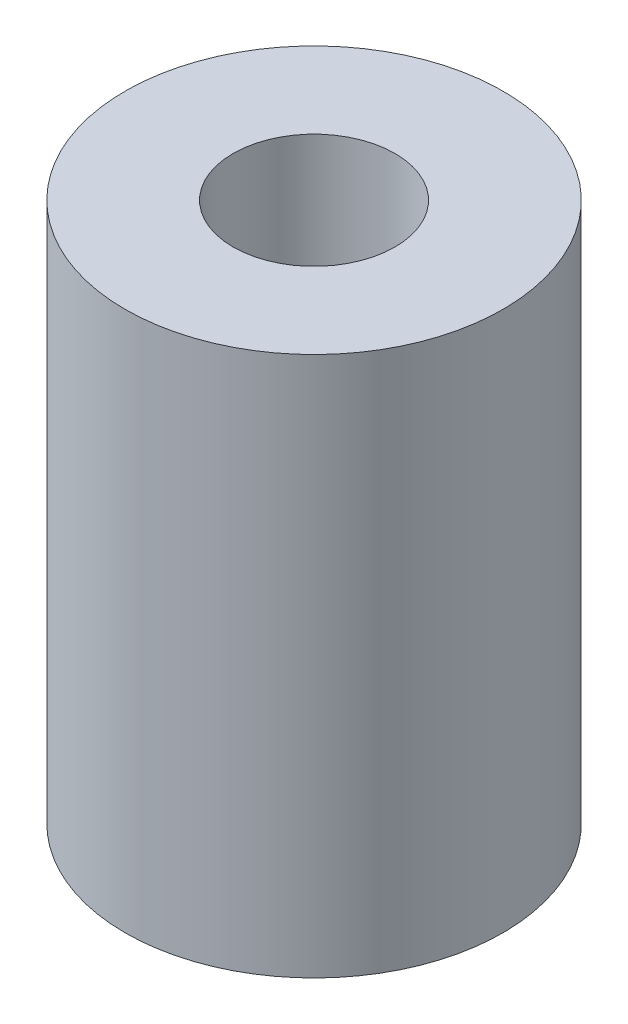
ISO-10303-21;
HEADER;
FILE_DESCRIPTION(('STEP AP214'),'2;1');
FILE_NAME('part.step','',(''),(''),'','','');
FILE_SCHEMA(('AUTOMOTIVE_DESIGN { 1 0 10303 214 1 1 1 1 }'));
ENDSEC;
DATA;
#1=APPLICATION_CONTEXT('core data for automotive mechanical design processes');
#2=APPLICATION_PROTOCOL_DEFINITION('international standard','automotive_design',2000,#1);
#3=PRODUCT_CONTEXT('',#1,'mechanical');
#4=PRODUCT('Part','Part','',(#3));
#5=PRODUCT_RELATED_PRODUCT_CATEGORY('part','',(#4));
#6=PRODUCT_DEFINITION_FORMATION('','',#4);
#7=PRODUCT_DEFINITION_CONTEXT('part definition',#1,'design');
#8=PRODUCT_DEFINITION('design','',#6,#7);
#9=PRODUCT_DEFINITION_SHAPE('','',#8);
#10=(LENGTH_UNIT() NAMED_UNIT(*) SI_UNIT(.MILLI.,.METRE.));
#11=(NAMED_UNIT(*) PLANE_ANGLE_UNIT() SI_UNIT($,.RADIAN.));
#12=(NAMED_UNIT(*) SI_UNIT($,.STERADIAN.) SOLID_ANGLE_UNIT());
#13=UNCERTAINTY_MEASURE_WITH_UNIT(LENGTH_MEASURE(1.E-05),#10,'distance_accuracy_value','');
#14=(GEOMETRIC_REPRESENTATION_CONTEXT(3) GLOBAL_UNCERTAINTY_ASSIGNED_CONTEXT((#13)) GLOBAL_UNIT_ASSIGNED_CONTEXT((#10,
#11,#12)) REPRESENTATION_CONTEXT('',''));
#15=CARTESIAN_POINT('',(0.,0.,0.));
#16=DIRECTION('',(0.,0.,1.));
#17=DIRECTION('',(1.,0.,0.));
#18=AXIS2_PLACEMENT_3D('',#15,#16,#17);
#19=CARTESIAN_POINT('',(0.,10.,0.));
#20=DIRECTION('',(0.,1.,0.));
#21=DIRECTION('',(0.,0.,1.));
#22=AXIS2_PLACEMENT_3D('',#19,#20,#21);
#23=PLANE('',#22);
#24=CARTESIAN_POINT('',(0.,10.,0.));
#25=DIRECTION('',(0.,1.,0.));
#26=DIRECTION('',(0.,0.,1.));
#27=AXIS2_PLACEMENT_3D('',#24,#25,#26);
#28=CIRCLE('',#27,3.5);
#29=CARTESIAN_POINT('',(0.,10.,3.5));
#30=VERTEX_POINT('',#29);
#31=EDGE_CURVE('E10',#30,#30,#28,.T.);
#32=ORIENTED_EDGE('',*,*,#31,.T.);
#33=EDGE_LOOP('',(#32));
#34=FACE_BOUND('',#33,.T.);
#35=CARTESIAN_POINT('',(0.,10.,0.));
#36=DIRECTION('',(0.,1.,0.));
#37=DIRECTION('',(0.,0.,1.));
#38=AXIS2_PLACEMENT_3D('',#35,#36,#37);
#39=CIRCLE('',#38,1.5);
#40=CARTESIAN_POINT('',(0.,10.,1.5));
#41=VERTEX_POINT('',#40);
#42=EDGE_CURVE('E53',#41,#41,#39,.T.);
#43=ORIENTED_EDGE('',*,*,#42,.F.);
#44=EDGE_LOOP('',(#43));
#45=FACE_BOUND('',#44,.T.);
#46=ADVANCED_FACE('F40',(#34,#45),#23,.T.);
#47=CARTESIAN_POINT('',(0.,0.,0.));
#48=DIRECTION('',(0.,1.,0.));
#49=DIRECTION('',(0.,0.,1.));
#50=AXIS2_PLACEMENT_3D('',#47,#48,#49);
#51=PLANE('',#50);
#52=CARTESIAN_POINT('',(0.,0.,0.));
#53=DIRECTION('',(0.,1.,0.));
#54=DIRECTION('',(0.,0.,1.));
#55=AXIS2_PLACEMENT_3D('',#52,#53,#54);
#56=CIRCLE('',#55,3.5);
#57=CARTESIAN_POINT('',(0.,0.,3.5));
#58=VERTEX_POINT('',#57);
#59=EDGE_CURVE('E44',#58,#58,#56,.T.);
#60=ORIENTED_EDGE('',*,*,#59,.F.);
#61=EDGE_LOOP('',(#60));
#62=FACE_BOUND('',#61,.T.);
#63=CARTESIAN_POINT('',(0.,0.,0.));
#64=DIRECTION('',(0.,1.,0.));
#65=DIRECTION('',(0.,0.,1.));
#66=AXIS2_PLACEMENT_3D('',#63,#64,#65);
#67=CIRCLE('',#66,1.5);
#68=CARTESIAN_POINT('',(0.,0.,1.5));
#69=VERTEX_POINT('',#68);
#70=EDGE_CURVE('E55',#69,#69,#67,.T.);
#71=ORIENTED_EDGE('',*,*,#70,.T.);
#72=EDGE_LOOP('',(#71));
#73=FACE_BOUND('',#72,.T.);
#74=ADVANCED_FACE('F67',(#62,#73),#51,.F.);
#75=CARTESIAN_POINT('',(0.,10.,0.));
#76=DIRECTION('',(0.,-1.,0.));
#77=DIRECTION('',(0.,0.,-1.));
#78=AXIS2_PLACEMENT_3D('',#75,#76,#77);
#79=CYLINDRICAL_SURFACE('',#78,3.5);
#80=ORIENTED_EDGE('',*,*,#31,.F.);
#81=EDGE_LOOP('',(#80));
#82=FACE_BOUND('',#81,.T.);
#83=ORIENTED_EDGE('',*,*,#59,.T.);
#84=EDGE_LOOP('',(#83));
#85=FACE_BOUND('',#84,.T.);
#86=ADVANCED_FACE('F42',(#82,#85),#79,.T.);
#87=CARTESIAN_POINT('',(0.,10.,0.));
#88=DIRECTION('',(0.,-1.,0.));
#89=DIRECTION('',(0.,0.,-1.));
#90=AXIS2_PLACEMENT_3D('',#87,#88,#89);
#91=CYLINDRICAL_SURFACE('',#90,1.5);
#92=ORIENTED_EDGE('',*,*,#42,.T.);
#93=EDGE_LOOP('',(#92));
#94=FACE_BOUND('',#93,.T.);
#95=ORIENTED_EDGE('',*,*,#70,.F.);
#96=EDGE_LOOP('',(#95));
#97=FACE_BOUND('',#96,.T.);
#98=ADVANCED_FACE('F63',(#94,#97),#91,.F.);
#99=CLOSED_SHELL('',(#46,#74,#86,#98));
#100=MANIFOLD_SOLID_BREP('B2',#99);
#101=ADVANCED_BREP_SHAPE_REPRESENTATION('',(#18,#100),#14);
#102=SHAPE_DEFINITION_REPRESENTATION(#9,#101);
ENDSEC;
END-ISO-10303-21;
